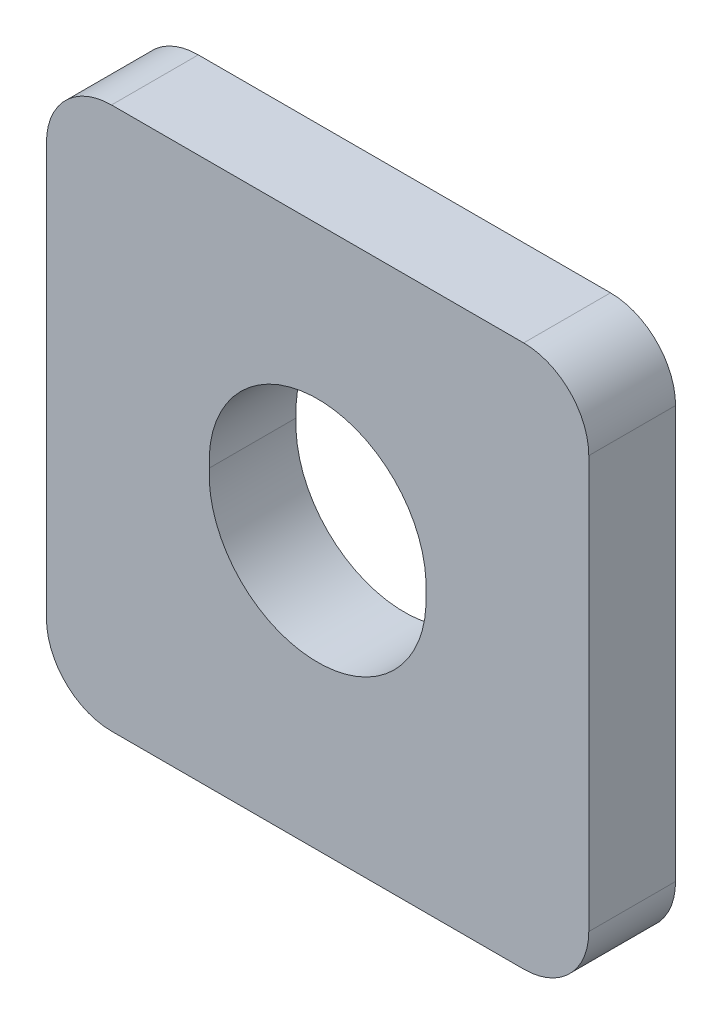
ISO-10303-21;
HEADER;
FILE_DESCRIPTION(('STEP AP214'),'2;1');
FILE_NAME('part.step','',(''),(''),'','','');
FILE_SCHEMA(('AUTOMOTIVE_DESIGN { 1 0 10303 214 1 1 1 1 }'));
ENDSEC;
DATA;
#1=APPLICATION_CONTEXT('core data for automotive mechanical design processes');
#2=APPLICATION_PROTOCOL_DEFINITION('international standard','automotive_design',2000,#1);
#3=PRODUCT_CONTEXT('',#1,'mechanical');
#4=PRODUCT('Part','Part','',(#3));
#5=PRODUCT_RELATED_PRODUCT_CATEGORY('part','',(#4));
#6=PRODUCT_DEFINITION_FORMATION('','',#4);
#7=PRODUCT_DEFINITION_CONTEXT('part definition',#1,'design');
#8=PRODUCT_DEFINITION('design','',#6,#7);
#9=PRODUCT_DEFINITION_SHAPE('','',#8);
#10=(LENGTH_UNIT() NAMED_UNIT(*) SI_UNIT(.MILLI.,.METRE.));
#11=(NAMED_UNIT(*) PLANE_ANGLE_UNIT() SI_UNIT($,.RADIAN.));
#12=(NAMED_UNIT(*) SI_UNIT($,.STERADIAN.) SOLID_ANGLE_UNIT());
#13=UNCERTAINTY_MEASURE_WITH_UNIT(LENGTH_MEASURE(1.E-05),#10,'distance_accuracy_value','');
#14=(GEOMETRIC_REPRESENTATION_CONTEXT(3) GLOBAL_UNCERTAINTY_ASSIGNED_CONTEXT((#13)) GLOBAL_UNIT_ASSIGNED_CONTEXT((#10,
#11,#12)) REPRESENTATION_CONTEXT('',''));
#15=CARTESIAN_POINT('',(0.,0.,0.));
#16=DIRECTION('',(0.,0.,1.));
#17=DIRECTION('',(1.,0.,0.));
#18=AXIS2_PLACEMENT_3D('',#15,#16,#17);
#19=CARTESIAN_POINT('',(-9.5,-9.5,4.));
#20=DIRECTION('',(0.,0.,-1.));
#21=DIRECTION('',(-1.,0.,0.));
#22=AXIS2_PLACEMENT_3D('',#19,#20,#21);
#23=PLANE('',#22);
#24=CARTESIAN_POINT('',(-9.5,-9.5,4.));
#25=DIRECTION('',(0.,0.,1.));
#26=DIRECTION('',(-1.,0.,0.));
#27=AXIS2_PLACEMENT_3D('',#24,#25,#26);
#28=CIRCLE('',#27,3.);
#29=CARTESIAN_POINT('',(-12.5,-9.5,4.));
#30=VERTEX_POINT('',#29);
#31=CARTESIAN_POINT('',(-9.5,-12.5,4.));
#32=VERTEX_POINT('',#31);
#33=EDGE_CURVE('E161',#30,#32,#28,.T.);
#34=ORIENTED_EDGE('',*,*,#33,.T.);
#35=DIRECTION('',(1.,0.,0.));
#36=VECTOR('',#35,1.);
#37=CARTESIAN_POINT('',(-9.5,-12.5,4.));
#38=LINE('',#37,#36);
#39=CARTESIAN_POINT('',(9.5,-12.5,4.));
#40=VERTEX_POINT('',#39);
#41=EDGE_CURVE('E102',#32,#40,#38,.T.);
#42=ORIENTED_EDGE('',*,*,#41,.T.);
#43=CARTESIAN_POINT('',(9.5,-9.5,4.));
#44=DIRECTION('',(0.,0.,1.));
#45=DIRECTION('',(1.,0.,0.));
#46=AXIS2_PLACEMENT_3D('',#43,#44,#45);
#47=CIRCLE('',#46,3.);
#48=CARTESIAN_POINT('',(12.5,-9.5,4.));
#49=VERTEX_POINT('',#48);
#50=EDGE_CURVE('E199',#40,#49,#47,.T.);
#51=ORIENTED_EDGE('',*,*,#50,.T.);
#52=DIRECTION('',(0.,1.,0.));
#53=VECTOR('',#52,1.);
#54=CARTESIAN_POINT('',(12.5,-9.5,4.));
#55=LINE('',#54,#53);
#56=CARTESIAN_POINT('',(12.5,9.5,4.));
#57=VERTEX_POINT('',#56);
#58=EDGE_CURVE('E201',#49,#57,#55,.T.);
#59=ORIENTED_EDGE('',*,*,#58,.T.);
#60=CARTESIAN_POINT('',(9.5,9.5,4.));
#61=DIRECTION('',(0.,0.,1.));
#62=DIRECTION('',(-1.,0.,0.));
#63=AXIS2_PLACEMENT_3D('',#60,#61,#62);
#64=CIRCLE('',#63,3.);
#65=CARTESIAN_POINT('',(9.5,12.5,4.));
#66=VERTEX_POINT('',#65);
#67=EDGE_CURVE('E124',#57,#66,#64,.T.);
#68=ORIENTED_EDGE('',*,*,#67,.T.);
#69=DIRECTION('',(-1.,0.,0.));
#70=VECTOR('',#69,1.);
#71=CARTESIAN_POINT('',(-9.5,12.5,4.));
#72=LINE('',#71,#70);
#73=CARTESIAN_POINT('',(-9.5,12.5,4.));
#74=VERTEX_POINT('',#73);
#75=EDGE_CURVE('E117',#66,#74,#72,.T.);
#76=ORIENTED_EDGE('',*,*,#75,.T.);
#77=CARTESIAN_POINT('',(-9.5,9.5,4.));
#78=DIRECTION('',(0.,0.,1.));
#79=DIRECTION('',(-1.,0.,0.));
#80=AXIS2_PLACEMENT_3D('',#77,#78,#79);
#81=CIRCLE('',#80,3.);
#82=CARTESIAN_POINT('',(-12.5,9.5,4.));
#83=VERTEX_POINT('',#82);
#84=EDGE_CURVE('E121',#74,#83,#81,.T.);
#85=ORIENTED_EDGE('',*,*,#84,.T.);
#86=DIRECTION('',(0.,-1.,0.));
#87=VECTOR('',#86,1.);
#88=CARTESIAN_POINT('',(-12.5,-9.5,4.));
#89=LINE('',#88,#87);
#90=EDGE_CURVE('E60',#83,#30,#89,.T.);
#91=ORIENTED_EDGE('',*,*,#90,.T.);
#92=EDGE_LOOP('',(#34,#42,#51,#59,#68,#76,#85,#91));
#93=FACE_BOUND('',#92,.T.);
#94=CARTESIAN_POINT('',(0.,0.,4.));
#95=DIRECTION('',(0.,0.,1.));
#96=DIRECTION('',(1.,0.,0.));
#97=AXIS2_PLACEMENT_3D('',#94,#95,#96);
#98=CIRCLE('',#97,5.);
#99=CARTESIAN_POINT('',(-4.99332632691743,0.258248316380326,4.));
#100=VERTEX_POINT('',#99);
#101=CARTESIAN_POINT('',(4.99332632691731,0.25824831638276,4.));
#102=VERTEX_POINT('',#101);
#103=EDGE_CURVE('E149',#100,#102,#98,.T.);
#104=ORIENTED_EDGE('',*,*,#103,.F.);
#105=CARTESIAN_POINT('',(-1.25888241619337E-13,0.516496632762431,4.));
#106=DIRECTION('',(0.,0.,-1.));
#107=DIRECTION('',(-1.,0.,0.));
#108=AXIS2_PLACEMENT_3D('',#105,#106,#107);
#109=CIRCLE('',#108,4.99999999999997);
#110=EDGE_CURVE('E51',#100,#102,#109,.T.);
#111=ORIENTED_EDGE('',*,*,#110,.T.);
#112=EDGE_LOOP('',(#104,#111));
#113=FACE_BOUND('',#112,.T.);
#114=ADVANCED_FACE('F37',(#93,#113),#23,.F.);
#115=CARTESIAN_POINT('',(-9.5,-9.5,0.));
#116=DIRECTION('',(0.,0.,-1.));
#117=DIRECTION('',(-1.,0.,0.));
#118=AXIS2_PLACEMENT_3D('',#115,#116,#117);
#119=PLANE('',#118);
#120=CARTESIAN_POINT('',(-1.25888241619337E-13,0.516496632762431,0.));
#121=DIRECTION('',(0.,0.,-1.));
#122=DIRECTION('',(-1.,0.,0.));
#123=AXIS2_PLACEMENT_3D('',#120,#121,#122);
#124=CIRCLE('',#123,4.99999999999997);
#125=CARTESIAN_POINT('',(-4.99332632691743,0.258248316380326,0.));
#126=VERTEX_POINT('',#125);
#127=CARTESIAN_POINT('',(4.99332632691731,0.25824831638276,0.));
#128=VERTEX_POINT('',#127);
#129=EDGE_CURVE('E179',#126,#128,#124,.T.);
#130=ORIENTED_EDGE('',*,*,#129,.F.);
#131=CARTESIAN_POINT('',(0.,0.,0.));
#132=DIRECTION('',(0.,0.,1.));
#133=DIRECTION('',(1.,0.,0.));
#134=AXIS2_PLACEMENT_3D('',#131,#132,#133);
#135=CIRCLE('',#134,5.);
#136=EDGE_CURVE('E191',#126,#128,#135,.T.);
#137=ORIENTED_EDGE('',*,*,#136,.T.);
#138=EDGE_LOOP('',(#130,#137));
#139=FACE_BOUND('',#138,.T.);
#140=CARTESIAN_POINT('',(-9.5,-9.5,0.));
#141=DIRECTION('',(0.,0.,1.));
#142=DIRECTION('',(-1.,0.,0.));
#143=AXIS2_PLACEMENT_3D('',#140,#141,#142);
#144=CIRCLE('',#143,3.);
#145=CARTESIAN_POINT('',(-12.5,-9.5,0.));
#146=VERTEX_POINT('',#145);
#147=CARTESIAN_POINT('',(-9.5,-12.5,0.));
#148=VERTEX_POINT('',#147);
#149=EDGE_CURVE('E145',#146,#148,#144,.T.);
#150=ORIENTED_EDGE('',*,*,#149,.F.);
#151=DIRECTION('',(0.,-1.,0.));
#152=VECTOR('',#151,1.);
#153=CARTESIAN_POINT('',(-12.5,-9.5,0.));
#154=LINE('',#153,#152);
#155=CARTESIAN_POINT('',(-12.5,9.5,0.));
#156=VERTEX_POINT('',#155);
#157=EDGE_CURVE('E93',#156,#146,#154,.T.);
#158=ORIENTED_EDGE('',*,*,#157,.F.);
#159=CARTESIAN_POINT('',(-9.5,9.5,0.));
#160=DIRECTION('',(0.,0.,1.));
#161=DIRECTION('',(-1.,0.,0.));
#162=AXIS2_PLACEMENT_3D('',#159,#160,#161);
#163=CIRCLE('',#162,3.);
#164=CARTESIAN_POINT('',(-9.5,12.5,0.));
#165=VERTEX_POINT('',#164);
#166=EDGE_CURVE('E158',#165,#156,#163,.T.);
#167=ORIENTED_EDGE('',*,*,#166,.F.);
#168=DIRECTION('',(-1.,0.,0.));
#169=VECTOR('',#168,1.);
#170=CARTESIAN_POINT('',(-9.5,12.5,0.));
#171=LINE('',#170,#169);
#172=CARTESIAN_POINT('',(9.5,12.5,0.));
#173=VERTEX_POINT('',#172);
#174=EDGE_CURVE('E133',#173,#165,#171,.T.);
#175=ORIENTED_EDGE('',*,*,#174,.F.);
#176=CARTESIAN_POINT('',(9.5,9.5,0.));
#177=DIRECTION('',(0.,0.,1.));
#178=DIRECTION('',(-1.,0.,0.));
#179=AXIS2_PLACEMENT_3D('',#176,#177,#178);
#180=CIRCLE('',#179,3.);
#181=CARTESIAN_POINT('',(12.5,9.5,0.));
#182=VERTEX_POINT('',#181);
#183=EDGE_CURVE('E155',#182,#173,#180,.T.);
#184=ORIENTED_EDGE('',*,*,#183,.F.);
#185=DIRECTION('',(0.,1.,0.));
#186=VECTOR('',#185,1.);
#187=CARTESIAN_POINT('',(12.5,-9.5,0.));
#188=LINE('',#187,#186);
#189=CARTESIAN_POINT('',(12.5,-9.5,0.));
#190=VERTEX_POINT('',#189);
#191=EDGE_CURVE('E153',#190,#182,#188,.T.);
#192=ORIENTED_EDGE('',*,*,#191,.F.);
#193=CARTESIAN_POINT('',(9.5,-9.5,0.));
#194=DIRECTION('',(0.,0.,1.));
#195=DIRECTION('',(1.,0.,0.));
#196=AXIS2_PLACEMENT_3D('',#193,#194,#195);
#197=CIRCLE('',#196,3.);
#198=CARTESIAN_POINT('',(9.5,-12.5,0.));
#199=VERTEX_POINT('',#198);
#200=EDGE_CURVE('E151',#199,#190,#197,.T.);
#201=ORIENTED_EDGE('',*,*,#200,.F.);
#202=DIRECTION('',(1.,0.,0.));
#203=VECTOR('',#202,1.);
#204=CARTESIAN_POINT('',(-9.5,-12.5,0.));
#205=LINE('',#204,#203);
#206=EDGE_CURVE('E148',#148,#199,#205,.T.);
#207=ORIENTED_EDGE('',*,*,#206,.F.);
#208=EDGE_LOOP('',(#150,#158,#167,#175,#184,#192,#201,#207));
#209=FACE_BOUND('',#208,.T.);
#210=ADVANCED_FACE('F189',(#139,#209),#119,.T.);
#211=CARTESIAN_POINT('',(-9.5,-9.5,4.));
#212=DIRECTION('',(0.,0.,-1.));
#213=DIRECTION('',(-1.,0.,0.));
#214=AXIS2_PLACEMENT_3D('',#211,#212,#213);
#215=CYLINDRICAL_SURFACE('',#214,3.);
#216=ORIENTED_EDGE('',*,*,#149,.T.);
#217=DIRECTION('',(0.,0.,-1.));
#218=VECTOR('',#217,1.);
#219=CARTESIAN_POINT('',(-9.5,-12.5,4.));
#220=LINE('',#219,#218);
#221=EDGE_CURVE('E174',#32,#148,#220,.T.);
#222=ORIENTED_EDGE('',*,*,#221,.F.);
#223=ORIENTED_EDGE('',*,*,#33,.F.);
#224=DIRECTION('',(0.,0.,-1.));
#225=VECTOR('',#224,1.);
#226=CARTESIAN_POINT('',(-12.5,-9.5,4.));
#227=LINE('',#226,#225);
#228=EDGE_CURVE('E141',#30,#146,#227,.T.);
#229=ORIENTED_EDGE('',*,*,#228,.T.);
#230=EDGE_LOOP('',(#216,#222,#223,#229));
#231=FACE_BOUND('',#230,.T.);
#232=ADVANCED_FACE('F39',(#231),#215,.T.);
#233=CARTESIAN_POINT('',(-9.5,-12.5,4.));
#234=DIRECTION('',(0.,1.,0.));
#235=DIRECTION('',(0.,0.,1.));
#236=AXIS2_PLACEMENT_3D('',#233,#234,#235);
#237=PLANE('',#236);
#238=ORIENTED_EDGE('',*,*,#206,.T.);
#239=DIRECTION('',(0.,0.,-1.));
#240=VECTOR('',#239,1.);
#241=CARTESIAN_POINT('',(9.5,-12.5,4.));
#242=LINE('',#241,#240);
#243=EDGE_CURVE('E171',#40,#199,#242,.T.);
#244=ORIENTED_EDGE('',*,*,#243,.F.);
#245=ORIENTED_EDGE('',*,*,#41,.F.);
#246=ORIENTED_EDGE('',*,*,#221,.T.);
#247=EDGE_LOOP('',(#238,#244,#245,#246));
#248=FACE_BOUND('',#247,.T.);
#249=ADVANCED_FACE('F217',(#248),#237,.F.);
#250=CARTESIAN_POINT('',(9.5,-9.5,4.));
#251=DIRECTION('',(0.,0.,-1.));
#252=DIRECTION('',(-1.,0.,0.));
#253=AXIS2_PLACEMENT_3D('',#250,#251,#252);
#254=CYLINDRICAL_SURFACE('',#253,3.);
#255=ORIENTED_EDGE('',*,*,#200,.T.);
#256=DIRECTION('',(0.,0.,-1.));
#257=VECTOR('',#256,1.);
#258=CARTESIAN_POINT('',(12.5,-9.5,4.));
#259=LINE('',#258,#257);
#260=EDGE_CURVE('E168',#49,#190,#259,.T.);
#261=ORIENTED_EDGE('',*,*,#260,.F.);
#262=ORIENTED_EDGE('',*,*,#50,.F.);
#263=ORIENTED_EDGE('',*,*,#243,.T.);
#264=EDGE_LOOP('',(#255,#261,#262,#263));
#265=FACE_BOUND('',#264,.T.);
#266=ADVANCED_FACE('F220',(#265),#254,.T.);
#267=CARTESIAN_POINT('',(12.5,-9.5,4.));
#268=DIRECTION('',(-1.,0.,0.));
#269=DIRECTION('',(0.,0.,1.));
#270=AXIS2_PLACEMENT_3D('',#267,#268,#269);
#271=PLANE('',#270);
#272=ORIENTED_EDGE('',*,*,#191,.T.);
#273=DIRECTION('',(0.,0.,-1.));
#274=VECTOR('',#273,1.);
#275=CARTESIAN_POINT('',(12.5,9.5,4.));
#276=LINE('',#275,#274);
#277=EDGE_CURVE('E165',#57,#182,#276,.T.);
#278=ORIENTED_EDGE('',*,*,#277,.F.);
#279=ORIENTED_EDGE('',*,*,#58,.F.);
#280=ORIENTED_EDGE('',*,*,#260,.T.);
#281=EDGE_LOOP('',(#272,#278,#279,#280));
#282=FACE_BOUND('',#281,.T.);
#283=ADVANCED_FACE('F207',(#282),#271,.F.);
#284=CARTESIAN_POINT('',(9.5,9.5,4.));
#285=DIRECTION('',(0.,0.,-1.));
#286=DIRECTION('',(-1.,0.,0.));
#287=AXIS2_PLACEMENT_3D('',#284,#285,#286);
#288=CYLINDRICAL_SURFACE('',#287,3.);
#289=ORIENTED_EDGE('',*,*,#183,.T.);
#290=DIRECTION('',(0.,0.,-1.));
#291=VECTOR('',#290,1.);
#292=CARTESIAN_POINT('',(9.5,12.5,4.));
#293=LINE('',#292,#291);
#294=EDGE_CURVE('E136',#66,#173,#293,.T.);
#295=ORIENTED_EDGE('',*,*,#294,.F.);
#296=ORIENTED_EDGE('',*,*,#67,.F.);
#297=ORIENTED_EDGE('',*,*,#277,.T.);
#298=EDGE_LOOP('',(#289,#295,#296,#297));
#299=FACE_BOUND('',#298,.T.);
#300=ADVANCED_FACE('F211',(#299),#288,.T.);
#301=CARTESIAN_POINT('',(-9.5,12.5,4.));
#302=DIRECTION('',(0.,-1.,0.));
#303=DIRECTION('',(0.,0.,-1.));
#304=AXIS2_PLACEMENT_3D('',#301,#302,#303);
#305=PLANE('',#304);
#306=ORIENTED_EDGE('',*,*,#174,.T.);
#307=DIRECTION('',(0.,0.,-1.));
#308=VECTOR('',#307,1.);
#309=CARTESIAN_POINT('',(-9.5,12.5,4.));
#310=LINE('',#309,#308);
#311=EDGE_CURVE('E130',#74,#165,#310,.T.);
#312=ORIENTED_EDGE('',*,*,#311,.F.);
#313=ORIENTED_EDGE('',*,*,#75,.F.);
#314=ORIENTED_EDGE('',*,*,#294,.T.);
#315=EDGE_LOOP('',(#306,#312,#313,#314));
#316=FACE_BOUND('',#315,.T.);
#317=ADVANCED_FACE('F131',(#316),#305,.F.);
#318=CARTESIAN_POINT('',(-9.5,9.5,4.));
#319=DIRECTION('',(0.,0.,-1.));
#320=DIRECTION('',(-1.,0.,0.));
#321=AXIS2_PLACEMENT_3D('',#318,#319,#320);
#322=CYLINDRICAL_SURFACE('',#321,3.);
#323=ORIENTED_EDGE('',*,*,#166,.T.);
#324=DIRECTION('',(0.,0.,-1.));
#325=VECTOR('',#324,1.);
#326=CARTESIAN_POINT('',(-12.5,9.5,4.));
#327=LINE('',#326,#325);
#328=EDGE_CURVE('E137',#83,#156,#327,.T.);
#329=ORIENTED_EDGE('',*,*,#328,.F.);
#330=ORIENTED_EDGE('',*,*,#84,.F.);
#331=ORIENTED_EDGE('',*,*,#311,.T.);
#332=EDGE_LOOP('',(#323,#329,#330,#331));
#333=FACE_BOUND('',#332,.T.);
#334=ADVANCED_FACE('F139',(#333),#322,.T.);
#335=CARTESIAN_POINT('',(-12.5,-9.5,4.));
#336=DIRECTION('',(1.,0.,0.));
#337=DIRECTION('',(0.,0.,-1.));
#338=AXIS2_PLACEMENT_3D('',#335,#336,#337);
#339=PLANE('',#338);
#340=ORIENTED_EDGE('',*,*,#157,.T.);
#341=ORIENTED_EDGE('',*,*,#228,.F.);
#342=ORIENTED_EDGE('',*,*,#90,.F.);
#343=ORIENTED_EDGE('',*,*,#328,.T.);
#344=EDGE_LOOP('',(#340,#341,#342,#343));
#345=FACE_BOUND('',#344,.T.);
#346=ADVANCED_FACE('F213',(#345),#339,.F.);
#347=CARTESIAN_POINT('',(0.,0.,4.));
#348=DIRECTION('',(0.,0.,-1.));
#349=DIRECTION('',(-1.,0.,0.));
#350=AXIS2_PLACEMENT_3D('',#347,#348,#349);
#351=CYLINDRICAL_SURFACE('',#350,5.);
#352=DIRECTION('',(0.,0.,1.));
#353=VECTOR('',#352,1.);
#354=CARTESIAN_POINT('',(4.99332632691731,0.25824831638276,-72.2500000000009));
#355=LINE('',#354,#353);
#356=EDGE_CURVE('E11',#128,#102,#355,.T.);
#357=ORIENTED_EDGE('',*,*,#356,.F.);
#358=ORIENTED_EDGE('',*,*,#136,.F.);
#359=DIRECTION('',(0.,0.,1.));
#360=VECTOR('',#359,1.);
#361=CARTESIAN_POINT('',(-4.99332632691743,0.258248316380326,-72.2500000000009));
#362=LINE('',#361,#360);
#363=EDGE_CURVE('E45',#100,#126,#362,.F.);
#364=ORIENTED_EDGE('',*,*,#363,.F.);
#365=ORIENTED_EDGE('',*,*,#103,.T.);
#366=EDGE_LOOP('',(#357,#358,#364,#365));
#367=FACE_BOUND('',#366,.T.);
#368=ADVANCED_FACE('F193',(#367),#351,.F.);
#369=CARTESIAN_POINT('',(-1.25888241619337E-13,0.516496632762431,38.9999999999991));
#370=DIRECTION('',(0.,0.,1.));
#371=DIRECTION('',(1.,0.,0.));
#372=AXIS2_PLACEMENT_3D('',#369,#370,#371);
#373=CYLINDRICAL_SURFACE('',#372,4.99999999999997);
#374=ORIENTED_EDGE('',*,*,#356,.T.);
#375=ORIENTED_EDGE('',*,*,#110,.F.);
#376=ORIENTED_EDGE('',*,*,#363,.T.);
#377=ORIENTED_EDGE('',*,*,#129,.T.);
#378=EDGE_LOOP('',(#374,#375,#376,#377));
#379=FACE_BOUND('',#378,.T.);
#380=ADVANCED_FACE('F178',(#379),#373,.F.);
#381=CLOSED_SHELL('',(#114,#210,#232,#249,#266,#283,#300,#317,#334,#346,#368,#380));
#382=MANIFOLD_SOLID_BREP('B2',#381);
#383=ADVANCED_BREP_SHAPE_REPRESENTATION('',(#18,#382),#14);
#384=SHAPE_DEFINITION_REPRESENTATION(#9,#383);
ENDSEC;
END-ISO-10303-21;
